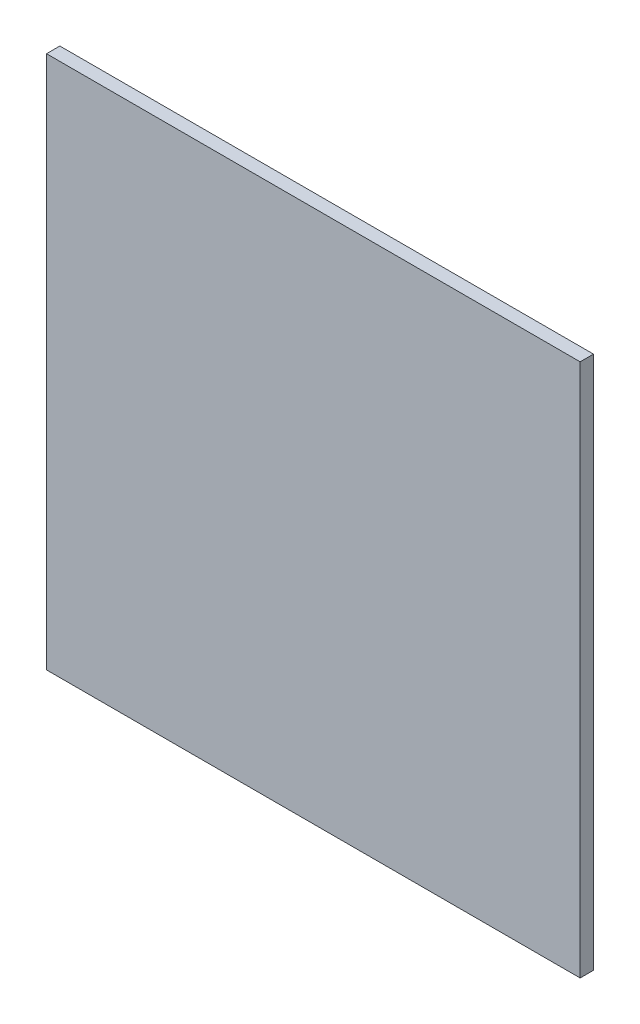
ISO-10303-21;
HEADER;
FILE_DESCRIPTION(('STEP AP214'),'2;1');
FILE_NAME('part.step','',(''),(''),'','','');
FILE_SCHEMA(('AUTOMOTIVE_DESIGN { 1 0 10303 214 1 1 1 1 }'));
ENDSEC;
DATA;
#1=APPLICATION_CONTEXT('core data for automotive mechanical design processes');
#2=APPLICATION_PROTOCOL_DEFINITION('international standard','automotive_design',2000,#1);
#3=PRODUCT_CONTEXT('',#1,'mechanical');
#4=PRODUCT('Part','Part','',(#3));
#5=PRODUCT_RELATED_PRODUCT_CATEGORY('part','',(#4));
#6=PRODUCT_DEFINITION_FORMATION('','',#4);
#7=PRODUCT_DEFINITION_CONTEXT('part definition',#1,'design');
#8=PRODUCT_DEFINITION('design','',#6,#7);
#9=PRODUCT_DEFINITION_SHAPE('','',#8);
#10=(LENGTH_UNIT() NAMED_UNIT(*) SI_UNIT(.MILLI.,.METRE.));
#11=(NAMED_UNIT(*) PLANE_ANGLE_UNIT() SI_UNIT($,.RADIAN.));
#12=(NAMED_UNIT(*) SI_UNIT($,.STERADIAN.) SOLID_ANGLE_UNIT());
#13=UNCERTAINTY_MEASURE_WITH_UNIT(LENGTH_MEASURE(1.E-05),#10,'distance_accuracy_value','');
#14=(GEOMETRIC_REPRESENTATION_CONTEXT(3) GLOBAL_UNCERTAINTY_ASSIGNED_CONTEXT((#13)) GLOBAL_UNIT_ASSIGNED_CONTEXT((#10,
#11,#12)) REPRESENTATION_CONTEXT('',''));
#15=CARTESIAN_POINT('',(0.,0.,0.));
#16=DIRECTION('',(0.,0.,1.));
#17=DIRECTION('',(1.,0.,0.));
#18=AXIS2_PLACEMENT_3D('',#15,#16,#17);
#19=CARTESIAN_POINT('',(-2.,-2.,0.1));
#20=DIRECTION('',(0.,0.,1.));
#21=DIRECTION('',(1.,0.,0.));
#22=AXIS2_PLACEMENT_3D('',#19,#20,#21);
#23=PLANE('',#22);
#24=DIRECTION('',(0.,1.,0.));
#25=VECTOR('',#24,1.);
#26=CARTESIAN_POINT('',(2.,-2.,0.1));
#27=LINE('',#26,#25);
#28=CARTESIAN_POINT('',(2.,2.,0.1));
#29=VERTEX_POINT('',#28);
#30=CARTESIAN_POINT('',(2.,-2.,0.1));
#31=VERTEX_POINT('',#30);
#32=EDGE_CURVE('E77',#29,#31,#27,.F.);
#33=ORIENTED_EDGE('',*,*,#32,.F.);
#34=DIRECTION('',(1.,0.,0.));
#35=VECTOR('',#34,1.);
#36=CARTESIAN_POINT('',(-2.,2.,0.1));
#37=LINE('',#36,#35);
#38=CARTESIAN_POINT('',(-2.,2.,0.1));
#39=VERTEX_POINT('',#38);
#40=EDGE_CURVE('E58',#39,#29,#37,.T.);
#41=ORIENTED_EDGE('',*,*,#40,.F.);
#42=DIRECTION('',(0.,1.,0.));
#43=VECTOR('',#42,1.);
#44=CARTESIAN_POINT('',(-2.,-2.,0.1));
#45=LINE('',#44,#43);
#46=CARTESIAN_POINT('',(-2.,-2.,0.1));
#47=VERTEX_POINT('',#46);
#48=EDGE_CURVE('E20',#39,#47,#45,.F.);
#49=ORIENTED_EDGE('',*,*,#48,.T.);
#50=DIRECTION('',(1.,0.,0.));
#51=VECTOR('',#50,1.);
#52=CARTESIAN_POINT('',(-2.,-2.,0.1));
#53=LINE('',#52,#51);
#54=EDGE_CURVE('E55',#47,#31,#53,.T.);
#55=ORIENTED_EDGE('',*,*,#54,.T.);
#56=EDGE_LOOP('',(#33,#41,#49,#55));
#57=FACE_BOUND('',#56,.T.);
#58=ADVANCED_FACE('F17',(#57),#23,.T.);
#59=CARTESIAN_POINT('',(-2.,-2.,0.));
#60=DIRECTION('',(1.,0.,0.));
#61=DIRECTION('',(0.,0.,-1.));
#62=AXIS2_PLACEMENT_3D('',#59,#60,#61);
#63=PLANE('',#62);
#64=DIRECTION('',(0.,0.,1.));
#65=VECTOR('',#64,1.);
#66=CARTESIAN_POINT('',(-2.,2.,0.));
#67=LINE('',#66,#65);
#68=CARTESIAN_POINT('',(-2.,2.,0.));
#69=VERTEX_POINT('',#68);
#70=EDGE_CURVE('E80',#69,#39,#67,.T.);
#71=ORIENTED_EDGE('',*,*,#70,.F.);
#72=DIRECTION('',(0.,1.,0.));
#73=VECTOR('',#72,1.);
#74=CARTESIAN_POINT('',(-2.,-2.,0.));
#75=LINE('',#74,#73);
#76=CARTESIAN_POINT('',(-2.,-2.,0.));
#77=VERTEX_POINT('',#76);
#78=EDGE_CURVE('E74',#69,#77,#75,.F.);
#79=ORIENTED_EDGE('',*,*,#78,.T.);
#80=DIRECTION('',(0.,0.,1.));
#81=VECTOR('',#80,1.);
#82=CARTESIAN_POINT('',(-2.,-2.,0.));
#83=LINE('',#82,#81);
#84=EDGE_CURVE('E64',#77,#47,#83,.T.);
#85=ORIENTED_EDGE('',*,*,#84,.T.);
#86=ORIENTED_EDGE('',*,*,#48,.F.);
#87=EDGE_LOOP('',(#71,#79,#85,#86));
#88=FACE_BOUND('',#87,.T.);
#89=ADVANCED_FACE('F73',(#88),#63,.F.);
#90=CARTESIAN_POINT('',(-2.,-2.,0.));
#91=DIRECTION('',(0.,1.,0.));
#92=DIRECTION('',(0.,0.,1.));
#93=AXIS2_PLACEMENT_3D('',#90,#91,#92);
#94=PLANE('',#93);
#95=ORIENTED_EDGE('',*,*,#54,.F.);
#96=ORIENTED_EDGE('',*,*,#84,.F.);
#97=DIRECTION('',(1.,0.,0.));
#98=VECTOR('',#97,1.);
#99=CARTESIAN_POINT('',(-2.,-2.,0.));
#100=LINE('',#99,#98);
#101=CARTESIAN_POINT('',(2.,-2.,0.));
#102=VERTEX_POINT('',#101);
#103=EDGE_CURVE('E86',#77,#102,#100,.T.);
#104=ORIENTED_EDGE('',*,*,#103,.T.);
#105=DIRECTION('',(0.,0.,-1.));
#106=VECTOR('',#105,1.);
#107=CARTESIAN_POINT('',(2.,-2.,0.));
#108=LINE('',#107,#106);
#109=EDGE_CURVE('E70',#31,#102,#108,.T.);
#110=ORIENTED_EDGE('',*,*,#109,.F.);
#111=EDGE_LOOP('',(#95,#96,#104,#110));
#112=FACE_BOUND('',#111,.T.);
#113=ADVANCED_FACE('F67',(#112),#94,.F.);
#114=CARTESIAN_POINT('',(2.,-2.,0.));
#115=DIRECTION('',(1.,0.,0.));
#116=DIRECTION('',(0.,0.,-1.));
#117=AXIS2_PLACEMENT_3D('',#114,#115,#116);
#118=PLANE('',#117);
#119=DIRECTION('',(0.,0.,1.));
#120=VECTOR('',#119,1.);
#121=CARTESIAN_POINT('',(2.,2.,0.));
#122=LINE('',#121,#120);
#123=CARTESIAN_POINT('',(2.,2.,0.));
#124=VERTEX_POINT('',#123);
#125=EDGE_CURVE('E34',#29,#124,#122,.F.);
#126=ORIENTED_EDGE('',*,*,#125,.F.);
#127=ORIENTED_EDGE('',*,*,#32,.T.);
#128=ORIENTED_EDGE('',*,*,#109,.T.);
#129=DIRECTION('',(0.,1.,0.));
#130=VECTOR('',#129,1.);
#131=CARTESIAN_POINT('',(2.,-2.,0.));
#132=LINE('',#131,#130);
#133=EDGE_CURVE('E26',#102,#124,#132,.T.);
#134=ORIENTED_EDGE('',*,*,#133,.T.);
#135=EDGE_LOOP('',(#126,#127,#128,#134));
#136=FACE_BOUND('',#135,.T.);
#137=ADVANCED_FACE('F94',(#136),#118,.T.);
#138=CARTESIAN_POINT('',(-2.,2.,0.));
#139=DIRECTION('',(0.,1.,0.));
#140=DIRECTION('',(0.,0.,1.));
#141=AXIS2_PLACEMENT_3D('',#138,#139,#140);
#142=PLANE('',#141);
#143=ORIENTED_EDGE('',*,*,#40,.T.);
#144=ORIENTED_EDGE('',*,*,#125,.T.);
#145=DIRECTION('',(1.,0.,0.));
#146=VECTOR('',#145,1.);
#147=CARTESIAN_POINT('',(-2.,2.,0.));
#148=LINE('',#147,#146);
#149=EDGE_CURVE('E11',#124,#69,#148,.F.);
#150=ORIENTED_EDGE('',*,*,#149,.T.);
#151=ORIENTED_EDGE('',*,*,#70,.T.);
#152=EDGE_LOOP('',(#143,#144,#150,#151));
#153=FACE_BOUND('',#152,.T.);
#154=ADVANCED_FACE('F97',(#153),#142,.T.);
#155=CARTESIAN_POINT('',(-2.,-2.,0.));
#156=DIRECTION('',(0.,0.,1.));
#157=DIRECTION('',(1.,0.,0.));
#158=AXIS2_PLACEMENT_3D('',#155,#156,#157);
#159=PLANE('',#158);
#160=ORIENTED_EDGE('',*,*,#133,.F.);
#161=ORIENTED_EDGE('',*,*,#103,.F.);
#162=ORIENTED_EDGE('',*,*,#78,.F.);
#163=ORIENTED_EDGE('',*,*,#149,.F.);
#164=EDGE_LOOP('',(#160,#161,#162,#163));
#165=FACE_BOUND('',#164,.T.);
#166=ADVANCED_FACE('F96',(#165),#159,.F.);
#167=CLOSED_SHELL('',(#58,#89,#113,#137,#154,#166));
#168=MANIFOLD_SOLID_BREP('B1',#167);
#169=ADVANCED_BREP_SHAPE_REPRESENTATION('',(#18,#168),#14);
#170=SHAPE_DEFINITION_REPRESENTATION(#9,#169);
ENDSEC;
END-ISO-10303-21;
